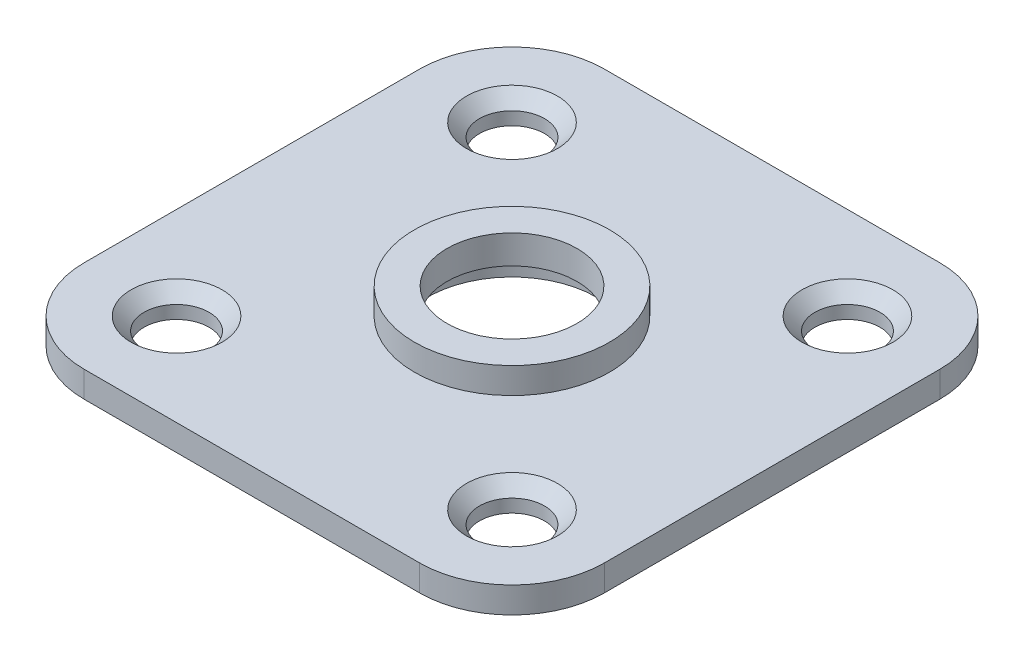
ISO-10303-21;
HEADER;
FILE_DESCRIPTION(('STEP AP214'),'2;1');
FILE_NAME('part.step','',(''),(''),'','','');
FILE_SCHEMA(('AUTOMOTIVE_DESIGN { 1 0 10303 214 1 1 1 1 }'));
ENDSEC;
DATA;
#1=APPLICATION_CONTEXT('core data for automotive mechanical design processes');
#2=APPLICATION_PROTOCOL_DEFINITION('international standard','automotive_design',2000,#1);
#3=PRODUCT_CONTEXT('',#1,'mechanical');
#4=PRODUCT('Part','Part','',(#3));
#5=PRODUCT_RELATED_PRODUCT_CATEGORY('part','',(#4));
#6=PRODUCT_DEFINITION_FORMATION('','',#4);
#7=PRODUCT_DEFINITION_CONTEXT('part definition',#1,'design');
#8=PRODUCT_DEFINITION('design','',#6,#7);
#9=PRODUCT_DEFINITION_SHAPE('','',#8);
#10=(LENGTH_UNIT() NAMED_UNIT(*) SI_UNIT(.MILLI.,.METRE.));
#11=(NAMED_UNIT(*) PLANE_ANGLE_UNIT() SI_UNIT($,.RADIAN.));
#12=(NAMED_UNIT(*) SI_UNIT($,.STERADIAN.) SOLID_ANGLE_UNIT());
#13=UNCERTAINTY_MEASURE_WITH_UNIT(LENGTH_MEASURE(1.E-05),#10,'distance_accuracy_value','');
#14=(GEOMETRIC_REPRESENTATION_CONTEXT(3) GLOBAL_UNCERTAINTY_ASSIGNED_CONTEXT((#13)) GLOBAL_UNIT_ASSIGNED_CONTEXT((#10,
#11,#12)) REPRESENTATION_CONTEXT('',''));
#15=CARTESIAN_POINT('',(0.,0.,0.));
#16=DIRECTION('',(0.,0.,1.));
#17=DIRECTION('',(1.,0.,0.));
#18=AXIS2_PLACEMENT_3D('',#15,#16,#17);
#19=CARTESIAN_POINT('',(25.4,-2.54,-25.4));
#20=DIRECTION('',(1.,0.,0.));
#21=DIRECTION('',(0.,0.,-1.));
#22=AXIS2_PLACEMENT_3D('',#19,#20,#21);
#23=PLANE('',#22);
#24=DIRECTION('',(0.,0.,-1.));
#25=VECTOR('',#24,1.);
#26=CARTESIAN_POINT('',(25.4,0.,-25.4));
#27=LINE('',#26,#25);
#28=CARTESIAN_POINT('',(25.4,0.,16.383));
#29=VERTEX_POINT('',#28);
#30=CARTESIAN_POINT('',(25.4,0.,-16.383));
#31=VERTEX_POINT('',#30);
#32=EDGE_CURVE('E122',#29,#31,#27,.T.);
#33=ORIENTED_EDGE('',*,*,#32,.F.);
#34=DIRECTION('',(0.,1.,0.));
#35=VECTOR('',#34,1.);
#36=CARTESIAN_POINT('',(25.4,-2.54,16.383));
#37=LINE('',#36,#35);
#38=CARTESIAN_POINT('',(25.4,-2.54,16.383));
#39=VERTEX_POINT('',#38);
#40=EDGE_CURVE('E173',#29,#39,#37,.F.);
#41=ORIENTED_EDGE('',*,*,#40,.T.);
#42=DIRECTION('',(0.,0.,-1.));
#43=VECTOR('',#42,1.);
#44=CARTESIAN_POINT('',(25.4,-2.54,-25.4));
#45=LINE('',#44,#43);
#46=CARTESIAN_POINT('',(25.4,-2.54,-16.383));
#47=VERTEX_POINT('',#46);
#48=EDGE_CURVE('E221',#39,#47,#45,.T.);
#49=ORIENTED_EDGE('',*,*,#48,.T.);
#50=DIRECTION('',(0.,1.,0.));
#51=VECTOR('',#50,1.);
#52=CARTESIAN_POINT('',(25.4,-2.54,-16.383));
#53=LINE('',#52,#51);
#54=EDGE_CURVE('E171',#47,#31,#53,.T.);
#55=ORIENTED_EDGE('',*,*,#54,.T.);
#56=EDGE_LOOP('',(#33,#41,#49,#55));
#57=FACE_BOUND('',#56,.T.);
#58=ADVANCED_FACE('F49',(#57),#23,.T.);
#59=CARTESIAN_POINT('',(-25.4,-2.54,25.4));
#60=DIRECTION('',(0.,0.,1.));
#61=DIRECTION('',(1.,0.,0.));
#62=AXIS2_PLACEMENT_3D('',#59,#60,#61);
#63=PLANE('',#62);
#64=DIRECTION('',(1.,0.,0.));
#65=VECTOR('',#64,1.);
#66=CARTESIAN_POINT('',(-25.4,0.,25.4));
#67=LINE('',#66,#65);
#68=CARTESIAN_POINT('',(-16.383,0.,25.4));
#69=VERTEX_POINT('',#68);
#70=CARTESIAN_POINT('',(16.383,0.,25.4));
#71=VERTEX_POINT('',#70);
#72=EDGE_CURVE('E148',#69,#71,#67,.T.);
#73=ORIENTED_EDGE('',*,*,#72,.F.);
#74=DIRECTION('',(0.,1.,0.));
#75=VECTOR('',#74,1.);
#76=CARTESIAN_POINT('',(-16.383,-2.54,25.4));
#77=LINE('',#76,#75);
#78=CARTESIAN_POINT('',(-16.383,-2.54,25.4));
#79=VERTEX_POINT('',#78);
#80=EDGE_CURVE('E72',#69,#79,#77,.F.);
#81=ORIENTED_EDGE('',*,*,#80,.T.);
#82=DIRECTION('',(1.,0.,0.));
#83=VECTOR('',#82,1.);
#84=CARTESIAN_POINT('',(-25.4,-2.54,25.4));
#85=LINE('',#84,#83);
#86=CARTESIAN_POINT('',(16.383,-2.54,25.4));
#87=VERTEX_POINT('',#86);
#88=EDGE_CURVE('E142',#79,#87,#85,.T.);
#89=ORIENTED_EDGE('',*,*,#88,.T.);
#90=DIRECTION('',(0.,1.,0.));
#91=VECTOR('',#90,1.);
#92=CARTESIAN_POINT('',(16.383,-2.54,25.4));
#93=LINE('',#92,#91);
#94=EDGE_CURVE('E167',#87,#71,#93,.T.);
#95=ORIENTED_EDGE('',*,*,#94,.T.);
#96=EDGE_LOOP('',(#73,#81,#89,#95));
#97=FACE_BOUND('',#96,.T.);
#98=ADVANCED_FACE('F231',(#97),#63,.T.);
#99=CARTESIAN_POINT('',(-25.4,-2.54,-25.4));
#100=DIRECTION('',(-1.,0.,0.));
#101=DIRECTION('',(0.,0.,1.));
#102=AXIS2_PLACEMENT_3D('',#99,#100,#101);
#103=PLANE('',#102);
#104=DIRECTION('',(0.,0.,1.));
#105=VECTOR('',#104,1.);
#106=CARTESIAN_POINT('',(-25.4,0.,-25.4));
#107=LINE('',#106,#105);
#108=CARTESIAN_POINT('',(-25.4,0.,-16.383));
#109=VERTEX_POINT('',#108);
#110=CARTESIAN_POINT('',(-25.4,0.,16.383));
#111=VERTEX_POINT('',#110);
#112=EDGE_CURVE('E137',#109,#111,#107,.T.);
#113=ORIENTED_EDGE('',*,*,#112,.F.);
#114=DIRECTION('',(0.,1.,0.));
#115=VECTOR('',#114,1.);
#116=CARTESIAN_POINT('',(-25.4,-2.54,-16.383));
#117=LINE('',#116,#115);
#118=CARTESIAN_POINT('',(-25.4,-2.54,-16.383));
#119=VERTEX_POINT('',#118);
#120=EDGE_CURVE('E159',#109,#119,#117,.F.);
#121=ORIENTED_EDGE('',*,*,#120,.T.);
#122=DIRECTION('',(0.,0.,1.));
#123=VECTOR('',#122,1.);
#124=CARTESIAN_POINT('',(-25.4,-2.54,-25.4));
#125=LINE('',#124,#123);
#126=CARTESIAN_POINT('',(-25.4,-2.54,16.383));
#127=VERTEX_POINT('',#126);
#128=EDGE_CURVE('E145',#119,#127,#125,.T.);
#129=ORIENTED_EDGE('',*,*,#128,.T.);
#130=DIRECTION('',(0.,1.,0.));
#131=VECTOR('',#130,1.);
#132=CARTESIAN_POINT('',(-25.4,-2.54,16.383));
#133=LINE('',#132,#131);
#134=EDGE_CURVE('E156',#127,#111,#133,.T.);
#135=ORIENTED_EDGE('',*,*,#134,.T.);
#136=EDGE_LOOP('',(#113,#121,#129,#135));
#137=FACE_BOUND('',#136,.T.);
#138=ADVANCED_FACE('F240',(#137),#103,.T.);
#139=CARTESIAN_POINT('',(-25.4,-2.54,-25.4));
#140=DIRECTION('',(0.,0.,-1.));
#141=DIRECTION('',(-1.,0.,0.));
#142=AXIS2_PLACEMENT_3D('',#139,#140,#141);
#143=PLANE('',#142);
#144=DIRECTION('',(-1.,0.,0.));
#145=VECTOR('',#144,1.);
#146=CARTESIAN_POINT('',(-25.4,-2.54,-25.4));
#147=LINE('',#146,#145);
#148=CARTESIAN_POINT('',(16.383,-2.54,-25.4));
#149=VERTEX_POINT('',#148);
#150=CARTESIAN_POINT('',(-16.383,-2.54,-25.4));
#151=VERTEX_POINT('',#150);
#152=EDGE_CURVE('E224',#149,#151,#147,.T.);
#153=ORIENTED_EDGE('',*,*,#152,.T.);
#154=DIRECTION('',(0.,1.,0.));
#155=VECTOR('',#154,1.);
#156=CARTESIAN_POINT('',(-16.383,-2.54,-25.4));
#157=LINE('',#156,#155);
#158=CARTESIAN_POINT('',(-16.383,0.,-25.4));
#159=VERTEX_POINT('',#158);
#160=EDGE_CURVE('E128',#151,#159,#157,.T.);
#161=ORIENTED_EDGE('',*,*,#160,.T.);
#162=DIRECTION('',(-1.,0.,0.));
#163=VECTOR('',#162,1.);
#164=CARTESIAN_POINT('',(-25.4,0.,-25.4));
#165=LINE('',#164,#163);
#166=CARTESIAN_POINT('',(16.383,0.,-25.4));
#167=VERTEX_POINT('',#166);
#168=EDGE_CURVE('E120',#167,#159,#165,.T.);
#169=ORIENTED_EDGE('',*,*,#168,.F.);
#170=DIRECTION('',(0.,1.,0.));
#171=VECTOR('',#170,1.);
#172=CARTESIAN_POINT('',(16.383,-2.54,-25.4));
#173=LINE('',#172,#171);
#174=EDGE_CURVE('E134',#167,#149,#173,.F.);
#175=ORIENTED_EDGE('',*,*,#174,.T.);
#176=EDGE_LOOP('',(#153,#161,#169,#175));
#177=FACE_BOUND('',#176,.T.);
#178=ADVANCED_FACE('F133',(#177),#143,.T.);
#179=CARTESIAN_POINT('',(0.,-2.54,0.));
#180=DIRECTION('',(0.,1.,0.));
#181=DIRECTION('',(0.,0.,1.));
#182=AXIS2_PLACEMENT_3D('',#179,#180,#181);
#183=PLANE('',#182);
#184=CARTESIAN_POINT('',(-16.383,-2.54,16.383));
#185=DIRECTION('',(0.,1.,0.));
#186=DIRECTION('',(0.,0.,1.));
#187=AXIS2_PLACEMENT_3D('',#184,#185,#186);
#188=CIRCLE('',#187,3.175);
#189=CARTESIAN_POINT('',(-16.383,-2.54,19.558));
#190=VERTEX_POINT('',#189);
#191=EDGE_CURVE('E469',#190,#190,#188,.T.);
#192=ORIENTED_EDGE('',*,*,#191,.T.);
#193=EDGE_LOOP('',(#192));
#194=FACE_BOUND('',#193,.T.);
#195=CARTESIAN_POINT('',(16.383,-2.54,16.383));
#196=DIRECTION('',(0.,-1.,0.));
#197=DIRECTION('',(0.,0.,1.));
#198=AXIS2_PLACEMENT_3D('',#195,#196,#197);
#199=CIRCLE('',#198,3.175);
#200=CARTESIAN_POINT('',(16.383,-2.54,19.558));
#201=VERTEX_POINT('',#200);
#202=EDGE_CURVE('E409',#201,#201,#199,.T.);
#203=ORIENTED_EDGE('',*,*,#202,.F.);
#204=EDGE_LOOP('',(#203));
#205=FACE_BOUND('',#204,.T.);
#206=CARTESIAN_POINT('',(16.383,-2.54,-16.383));
#207=DIRECTION('',(0.,1.,0.));
#208=DIRECTION('',(0.,0.,-1.));
#209=AXIS2_PLACEMENT_3D('',#206,#207,#208);
#210=CIRCLE('',#209,3.175);
#211=CARTESIAN_POINT('',(16.383,-2.54,-19.558));
#212=VERTEX_POINT('',#211);
#213=EDGE_CURVE('E403',#212,#212,#210,.T.);
#214=ORIENTED_EDGE('',*,*,#213,.T.);
#215=EDGE_LOOP('',(#214));
#216=FACE_BOUND('',#215,.T.);
#217=CARTESIAN_POINT('',(-16.383,-2.54,-16.383));
#218=DIRECTION('',(0.,-1.,0.));
#219=DIRECTION('',(0.,0.,-1.));
#220=AXIS2_PLACEMENT_3D('',#217,#218,#219);
#221=CIRCLE('',#220,3.175);
#222=CARTESIAN_POINT('',(-16.383,-2.54,-19.558));
#223=VERTEX_POINT('',#222);
#224=EDGE_CURVE('E400',#223,#223,#221,.T.);
#225=ORIENTED_EDGE('',*,*,#224,.F.);
#226=EDGE_LOOP('',(#225));
#227=FACE_BOUND('',#226,.T.);
#228=CARTESIAN_POINT('',(0.,-2.54,0.));
#229=DIRECTION('',(0.,-1.,0.));
#230=DIRECTION('',(0.,0.,-1.));
#231=AXIS2_PLACEMENT_3D('',#228,#229,#230);
#232=CIRCLE('',#231,8.255);
#233=CARTESIAN_POINT('',(0.,-2.54,-8.255));
#234=VERTEX_POINT('',#233);
#235=EDGE_CURVE('E414',#234,#234,#232,.T.);
#236=ORIENTED_EDGE('',*,*,#235,.F.);
#237=EDGE_LOOP('',(#236));
#238=FACE_BOUND('',#237,.T.);
#239=ORIENTED_EDGE('',*,*,#128,.F.);
#240=CARTESIAN_POINT('',(-16.383,-2.54,-16.383));
#241=DIRECTION('',(0.,1.,0.));
#242=DIRECTION('',(0.,0.,1.));
#243=AXIS2_PLACEMENT_3D('',#240,#241,#242);
#244=CIRCLE('',#243,9.017);
#245=EDGE_CURVE('E165',#119,#151,#244,.F.);
#246=ORIENTED_EDGE('',*,*,#245,.T.);
#247=ORIENTED_EDGE('',*,*,#152,.F.);
#248=CARTESIAN_POINT('',(16.383,-2.54,-16.383));
#249=DIRECTION('',(0.,1.,0.));
#250=DIRECTION('',(0.,0.,1.));
#251=AXIS2_PLACEMENT_3D('',#248,#249,#250);
#252=CIRCLE('',#251,9.017);
#253=EDGE_CURVE('E141',#149,#47,#252,.F.);
#254=ORIENTED_EDGE('',*,*,#253,.T.);
#255=ORIENTED_EDGE('',*,*,#48,.F.);
#256=CARTESIAN_POINT('',(16.383,-2.54,16.383));
#257=DIRECTION('',(0.,1.,0.));
#258=DIRECTION('',(0.,0.,1.));
#259=AXIS2_PLACEMENT_3D('',#256,#257,#258);
#260=CIRCLE('',#259,9.017);
#261=EDGE_CURVE('E65',#39,#87,#260,.F.);
#262=ORIENTED_EDGE('',*,*,#261,.T.);
#263=ORIENTED_EDGE('',*,*,#88,.F.);
#264=CARTESIAN_POINT('',(-16.383,-2.54,16.383));
#265=DIRECTION('',(0.,1.,0.));
#266=DIRECTION('',(0.,0.,1.));
#267=AXIS2_PLACEMENT_3D('',#264,#265,#266);
#268=CIRCLE('',#267,9.017);
#269=EDGE_CURVE('E163',#79,#127,#268,.F.);
#270=ORIENTED_EDGE('',*,*,#269,.T.);
#271=EDGE_LOOP('',(#239,#246,#247,#254,#255,#262,#263,#270));
#272=FACE_BOUND('',#271,.T.);
#273=ADVANCED_FACE('F208',(#194,#205,#216,#227,#238,#272),#183,.F.);
#274=CARTESIAN_POINT('',(0.,0.,0.));
#275=DIRECTION('',(0.,1.,0.));
#276=DIRECTION('',(0.,0.,1.));
#277=AXIS2_PLACEMENT_3D('',#274,#275,#276);
#278=PLANE('',#277);
#279=CARTESIAN_POINT('',(-16.383,0.,16.383));
#280=DIRECTION('',(0.,1.,0.));
#281=DIRECTION('',(0.,0.,1.));
#282=AXIS2_PLACEMENT_3D('',#279,#280,#281);
#283=CIRCLE('',#282,4.445);
#284=CARTESIAN_POINT('',(-16.383,0.,20.828));
#285=VERTEX_POINT('',#284);
#286=EDGE_CURVE('E185',#285,#285,#283,.F.);
#287=ORIENTED_EDGE('',*,*,#286,.T.);
#288=EDGE_LOOP('',(#287));
#289=FACE_BOUND('',#288,.T.);
#290=CARTESIAN_POINT('',(16.383,0.,16.383));
#291=DIRECTION('',(0.,1.,0.));
#292=DIRECTION('',(0.,0.,1.));
#293=AXIS2_PLACEMENT_3D('',#290,#291,#292);
#294=CIRCLE('',#293,4.44499999999999);
#295=CARTESIAN_POINT('',(16.383,0.,20.828));
#296=VERTEX_POINT('',#295);
#297=EDGE_CURVE('E182',#296,#296,#294,.F.);
#298=ORIENTED_EDGE('',*,*,#297,.T.);
#299=EDGE_LOOP('',(#298));
#300=FACE_BOUND('',#299,.T.);
#301=CARTESIAN_POINT('',(16.383,0.,-16.383));
#302=DIRECTION('',(0.,1.,0.));
#303=DIRECTION('',(0.,0.,1.));
#304=AXIS2_PLACEMENT_3D('',#301,#302,#303);
#305=CIRCLE('',#304,4.445);
#306=CARTESIAN_POINT('',(16.383,0.,-11.938));
#307=VERTEX_POINT('',#306);
#308=EDGE_CURVE('E179',#307,#307,#305,.F.);
#309=ORIENTED_EDGE('',*,*,#308,.T.);
#310=EDGE_LOOP('',(#309));
#311=FACE_BOUND('',#310,.T.);
#312=CARTESIAN_POINT('',(-16.383,0.,-16.383));
#313=DIRECTION('',(0.,1.,0.));
#314=DIRECTION('',(0.,0.,1.));
#315=AXIS2_PLACEMENT_3D('',#312,#313,#314);
#316=CIRCLE('',#315,4.44499999999999);
#317=CARTESIAN_POINT('',(-16.383,0.,-11.938));
#318=VERTEX_POINT('',#317);
#319=EDGE_CURVE('E176',#318,#318,#316,.F.);
#320=ORIENTED_EDGE('',*,*,#319,.T.);
#321=EDGE_LOOP('',(#320));
#322=FACE_BOUND('',#321,.T.);
#323=CARTESIAN_POINT('',(0.,0.,0.));
#324=DIRECTION('',(0.,1.,0.));
#325=DIRECTION('',(0.,0.,1.));
#326=AXIS2_PLACEMENT_3D('',#323,#324,#325);
#327=CIRCLE('',#326,9.525);
#328=CARTESIAN_POINT('',(0.,0.,9.525));
#329=VERTEX_POINT('',#328);
#330=EDGE_CURVE('E175',#329,#329,#327,.T.);
#331=ORIENTED_EDGE('',*,*,#330,.F.);
#332=EDGE_LOOP('',(#331));
#333=FACE_BOUND('',#332,.T.);
#334=ORIENTED_EDGE('',*,*,#168,.T.);
#335=CARTESIAN_POINT('',(-16.383,0.,-16.383));
#336=DIRECTION('',(0.,1.,0.));
#337=DIRECTION('',(0.,0.,1.));
#338=AXIS2_PLACEMENT_3D('',#335,#336,#337);
#339=CIRCLE('',#338,9.017);
#340=EDGE_CURVE('E154',#159,#109,#339,.T.);
#341=ORIENTED_EDGE('',*,*,#340,.T.);
#342=ORIENTED_EDGE('',*,*,#112,.T.);
#343=CARTESIAN_POINT('',(-16.383,0.,16.383));
#344=DIRECTION('',(0.,1.,0.));
#345=DIRECTION('',(0.,0.,1.));
#346=AXIS2_PLACEMENT_3D('',#343,#344,#345);
#347=CIRCLE('',#346,9.017);
#348=EDGE_CURVE('E152',#111,#69,#347,.T.);
#349=ORIENTED_EDGE('',*,*,#348,.T.);
#350=ORIENTED_EDGE('',*,*,#72,.T.);
#351=CARTESIAN_POINT('',(16.383,0.,16.383));
#352=DIRECTION('',(0.,1.,0.));
#353=DIRECTION('',(0.,0.,1.));
#354=AXIS2_PLACEMENT_3D('',#351,#352,#353);
#355=CIRCLE('',#354,9.017);
#356=EDGE_CURVE('E127',#71,#29,#355,.T.);
#357=ORIENTED_EDGE('',*,*,#356,.T.);
#358=ORIENTED_EDGE('',*,*,#32,.T.);
#359=CARTESIAN_POINT('',(16.383,0.,-16.383));
#360=DIRECTION('',(0.,1.,0.));
#361=DIRECTION('',(0.,0.,1.));
#362=AXIS2_PLACEMENT_3D('',#359,#360,#361);
#363=CIRCLE('',#362,9.017);
#364=EDGE_CURVE('E117',#31,#167,#363,.T.);
#365=ORIENTED_EDGE('',*,*,#364,.T.);
#366=EDGE_LOOP('',(#334,#341,#342,#349,#350,#357,#358,#365));
#367=FACE_BOUND('',#366,.T.);
#368=ADVANCED_FACE('F119',(#289,#300,#311,#322,#333,#367),#278,.T.);
#369=CARTESIAN_POINT('',(-16.383,-2.54,-16.383));
#370=DIRECTION('',(0.,1.,0.));
#371=DIRECTION('',(0.,0.,1.));
#372=AXIS2_PLACEMENT_3D('',#369,#370,#371);
#373=CYLINDRICAL_SURFACE('',#372,9.017);
#374=ORIENTED_EDGE('',*,*,#245,.F.);
#375=ORIENTED_EDGE('',*,*,#120,.F.);
#376=ORIENTED_EDGE('',*,*,#340,.F.);
#377=ORIENTED_EDGE('',*,*,#160,.F.);
#378=EDGE_LOOP('',(#374,#375,#376,#377));
#379=FACE_BOUND('',#378,.T.);
#380=ADVANCED_FACE('F207',(#379),#373,.T.);
#381=CARTESIAN_POINT('',(-16.383,-2.54,16.383));
#382=DIRECTION('',(0.,1.,0.));
#383=DIRECTION('',(0.,0.,1.));
#384=AXIS2_PLACEMENT_3D('',#381,#382,#383);
#385=CYLINDRICAL_SURFACE('',#384,9.017);
#386=ORIENTED_EDGE('',*,*,#269,.F.);
#387=ORIENTED_EDGE('',*,*,#80,.F.);
#388=ORIENTED_EDGE('',*,*,#348,.F.);
#389=ORIENTED_EDGE('',*,*,#134,.F.);
#390=EDGE_LOOP('',(#386,#387,#388,#389));
#391=FACE_BOUND('',#390,.T.);
#392=ADVANCED_FACE('F235',(#391),#385,.T.);
#393=CARTESIAN_POINT('',(16.383,-2.54,16.383));
#394=DIRECTION('',(0.,1.,0.));
#395=DIRECTION('',(0.,0.,1.));
#396=AXIS2_PLACEMENT_3D('',#393,#394,#395);
#397=CYLINDRICAL_SURFACE('',#396,9.017);
#398=ORIENTED_EDGE('',*,*,#261,.F.);
#399=ORIENTED_EDGE('',*,*,#40,.F.);
#400=ORIENTED_EDGE('',*,*,#356,.F.);
#401=ORIENTED_EDGE('',*,*,#94,.F.);
#402=EDGE_LOOP('',(#398,#399,#400,#401));
#403=FACE_BOUND('',#402,.T.);
#404=ADVANCED_FACE('F246',(#403),#397,.T.);
#405=CARTESIAN_POINT('',(16.383,-2.54,-16.383));
#406=DIRECTION('',(0.,1.,0.));
#407=DIRECTION('',(0.,0.,1.));
#408=AXIS2_PLACEMENT_3D('',#405,#406,#407);
#409=CYLINDRICAL_SURFACE('',#408,9.017);
#410=ORIENTED_EDGE('',*,*,#253,.F.);
#411=ORIENTED_EDGE('',*,*,#174,.F.);
#412=ORIENTED_EDGE('',*,*,#364,.F.);
#413=ORIENTED_EDGE('',*,*,#54,.F.);
#414=EDGE_LOOP('',(#410,#411,#412,#413));
#415=FACE_BOUND('',#414,.T.);
#416=ADVANCED_FACE('F140',(#415),#409,.T.);
#417=CARTESIAN_POINT('',(0.,2.54,0.));
#418=DIRECTION('',(0.,-1.,0.));
#419=DIRECTION('',(0.,0.,-1.));
#420=AXIS2_PLACEMENT_3D('',#417,#418,#419);
#421=CYLINDRICAL_SURFACE('',#420,9.525);
#422=CARTESIAN_POINT('',(0.,2.54,0.));
#423=DIRECTION('',(0.,1.,0.));
#424=DIRECTION('',(0.,0.,1.));
#425=AXIS2_PLACEMENT_3D('',#422,#423,#424);
#426=CIRCLE('',#425,9.525);
#427=CARTESIAN_POINT('',(0.,2.54,9.525));
#428=VERTEX_POINT('',#427);
#429=EDGE_CURVE('E219',#428,#428,#426,.T.);
#430=ORIENTED_EDGE('',*,*,#429,.F.);
#431=EDGE_LOOP('',(#430));
#432=FACE_BOUND('',#431,.T.);
#433=ORIENTED_EDGE('',*,*,#330,.T.);
#434=EDGE_LOOP('',(#433));
#435=FACE_BOUND('',#434,.T.);
#436=ADVANCED_FACE('F253',(#432,#435),#421,.T.);
#437=CARTESIAN_POINT('',(0.,2.54,0.));
#438=DIRECTION('',(0.,1.,0.));
#439=DIRECTION('',(0.,0.,1.));
#440=AXIS2_PLACEMENT_3D('',#437,#438,#439);
#441=PLANE('',#440);
#442=CARTESIAN_POINT('',(0.,2.54,0.));
#443=DIRECTION('',(0.,-1.,0.));
#444=DIRECTION('',(0.,0.,-1.));
#445=AXIS2_PLACEMENT_3D('',#442,#443,#444);
#446=CIRCLE('',#445,6.35);
#447=CARTESIAN_POINT('',(0.,2.54,-6.35));
#448=VERTEX_POINT('',#447);
#449=EDGE_CURVE('E406',#448,#448,#446,.T.);
#450=ORIENTED_EDGE('',*,*,#449,.T.);
#451=EDGE_LOOP('',(#450));
#452=FACE_BOUND('',#451,.T.);
#453=ORIENTED_EDGE('',*,*,#429,.T.);
#454=EDGE_LOOP('',(#453));
#455=FACE_BOUND('',#454,.T.);
#456=ADVANCED_FACE('F290',(#452,#455),#441,.T.);
#457=CARTESIAN_POINT('',(0.,-0.254,0.));
#458=DIRECTION('',(0.,-1.,0.));
#459=DIRECTION('',(0.,0.,-1.));
#460=AXIS2_PLACEMENT_3D('',#457,#458,#459);
#461=CYLINDRICAL_SURFACE('',#460,8.255);
#462=CARTESIAN_POINT('',(0.,-0.254,0.));
#463=DIRECTION('',(0.,-1.,0.));
#464=DIRECTION('',(0.,0.,-1.));
#465=AXIS2_PLACEMENT_3D('',#462,#463,#464);
#466=CIRCLE('',#465,8.255);
#467=CARTESIAN_POINT('',(0.,-0.254,-8.255));
#468=VERTEX_POINT('',#467);
#469=EDGE_CURVE('E416',#468,#468,#466,.T.);
#470=ORIENTED_EDGE('',*,*,#469,.F.);
#471=EDGE_LOOP('',(#470));
#472=FACE_BOUND('',#471,.T.);
#473=ORIENTED_EDGE('',*,*,#235,.T.);
#474=EDGE_LOOP('',(#473));
#475=FACE_BOUND('',#474,.T.);
#476=ADVANCED_FACE('F299',(#472,#475),#461,.F.);
#477=CARTESIAN_POINT('',(0.,-0.254,0.));
#478=DIRECTION('',(0.,-1.,0.));
#479=DIRECTION('',(0.,0.,-1.));
#480=AXIS2_PLACEMENT_3D('',#477,#478,#479);
#481=PLANE('',#480);
#482=CARTESIAN_POINT('',(0.,-0.254,0.));
#483=DIRECTION('',(0.,-1.,0.));
#484=DIRECTION('',(0.,0.,-1.));
#485=AXIS2_PLACEMENT_3D('',#482,#483,#484);
#486=CIRCLE('',#485,6.35);
#487=CARTESIAN_POINT('',(0.,-0.254,-6.35));
#488=VERTEX_POINT('',#487);
#489=EDGE_CURVE('E402',#488,#488,#486,.T.);
#490=ORIENTED_EDGE('',*,*,#489,.F.);
#491=EDGE_LOOP('',(#490));
#492=FACE_BOUND('',#491,.T.);
#493=ORIENTED_EDGE('',*,*,#469,.T.);
#494=EDGE_LOOP('',(#493));
#495=FACE_BOUND('',#494,.T.);
#496=ADVANCED_FACE('F309',(#492,#495),#481,.T.);
#497=CARTESIAN_POINT('',(0.,2.54,0.));
#498=DIRECTION('',(0.,-1.,0.));
#499=DIRECTION('',(0.,0.,-1.));
#500=AXIS2_PLACEMENT_3D('',#497,#498,#499);
#501=CYLINDRICAL_SURFACE('',#500,6.35);
#502=ORIENTED_EDGE('',*,*,#449,.F.);
#503=EDGE_LOOP('',(#502));
#504=FACE_BOUND('',#503,.T.);
#505=ORIENTED_EDGE('',*,*,#489,.T.);
#506=EDGE_LOOP('',(#505));
#507=FACE_BOUND('',#506,.T.);
#508=ADVANCED_FACE('F321',(#504,#507),#501,.F.);
#509=CARTESIAN_POINT('',(-16.383,2.54,-16.383));
#510=DIRECTION('',(0.,-1.,0.));
#511=DIRECTION('',(0.,0.,-1.));
#512=AXIS2_PLACEMENT_3D('',#509,#510,#511);
#513=CYLINDRICAL_SURFACE('',#512,3.175);
#514=CARTESIAN_POINT('',(-16.383,-1.26999999999998,-16.383));
#515=DIRECTION('',(0.,1.,0.));
#516=DIRECTION('',(0.,0.,1.));
#517=AXIS2_PLACEMENT_3D('',#514,#515,#516);
#518=CIRCLE('',#517,3.175);
#519=CARTESIAN_POINT('',(-16.383,-1.26999999999998,-13.208));
#520=VERTEX_POINT('',#519);
#521=EDGE_CURVE('E11',#520,#520,#518,.T.);
#522=ORIENTED_EDGE('',*,*,#521,.T.);
#523=EDGE_LOOP('',(#522));
#524=FACE_BOUND('',#523,.T.);
#525=ORIENTED_EDGE('',*,*,#224,.T.);
#526=EDGE_LOOP('',(#525));
#527=FACE_BOUND('',#526,.T.);
#528=ADVANCED_FACE('F330',(#524,#527),#513,.F.);
#529=CARTESIAN_POINT('',(16.383,2.54,-16.383));
#530=DIRECTION('',(0.,-1.,0.));
#531=DIRECTION('',(0.,0.,-1.));
#532=AXIS2_PLACEMENT_3D('',#529,#530,#531);
#533=CYLINDRICAL_SURFACE('',#532,3.175);
#534=CARTESIAN_POINT('',(16.383,-1.27,-16.383));
#535=DIRECTION('',(0.,1.,0.));
#536=DIRECTION('',(0.,0.,1.));
#537=AXIS2_PLACEMENT_3D('',#534,#535,#536);
#538=CIRCLE('',#537,3.175);
#539=CARTESIAN_POINT('',(16.383,-1.27,-13.208));
#540=VERTEX_POINT('',#539);
#541=EDGE_CURVE('E58',#540,#540,#538,.T.);
#542=ORIENTED_EDGE('',*,*,#541,.T.);
#543=EDGE_LOOP('',(#542));
#544=FACE_BOUND('',#543,.T.);
#545=ORIENTED_EDGE('',*,*,#213,.F.);
#546=EDGE_LOOP('',(#545));
#547=FACE_BOUND('',#546,.T.);
#548=ADVANCED_FACE('F196',(#544,#547),#533,.F.);
#549=CARTESIAN_POINT('',(16.383,2.54,16.383));
#550=DIRECTION('',(0.,-1.,0.));
#551=DIRECTION('',(0.,0.,-1.));
#552=AXIS2_PLACEMENT_3D('',#549,#550,#551);
#553=CYLINDRICAL_SURFACE('',#552,3.175);
#554=CARTESIAN_POINT('',(16.383,-1.26999999999998,16.383));
#555=DIRECTION('',(0.,1.,0.));
#556=DIRECTION('',(0.,0.,1.));
#557=AXIS2_PLACEMENT_3D('',#554,#555,#556);
#558=CIRCLE('',#557,3.175);
#559=CARTESIAN_POINT('',(16.383,-1.26999999999998,19.558));
#560=VERTEX_POINT('',#559);
#561=EDGE_CURVE('E191',#560,#560,#558,.T.);
#562=ORIENTED_EDGE('',*,*,#561,.T.);
#563=EDGE_LOOP('',(#562));
#564=FACE_BOUND('',#563,.T.);
#565=ORIENTED_EDGE('',*,*,#202,.T.);
#566=EDGE_LOOP('',(#565));
#567=FACE_BOUND('',#566,.T.);
#568=ADVANCED_FACE('F348',(#564,#567),#553,.F.);
#569=CARTESIAN_POINT('',(-16.383,2.54,16.383));
#570=DIRECTION('',(0.,-1.,0.));
#571=DIRECTION('',(0.,0.,-1.));
#572=AXIS2_PLACEMENT_3D('',#569,#570,#571);
#573=CYLINDRICAL_SURFACE('',#572,3.175);
#574=CARTESIAN_POINT('',(-16.383,-1.27,16.383));
#575=DIRECTION('',(0.,1.,0.));
#576=DIRECTION('',(0.,0.,1.));
#577=AXIS2_PLACEMENT_3D('',#574,#575,#576);
#578=CIRCLE('',#577,3.175);
#579=CARTESIAN_POINT('',(-16.383,-1.27,19.558));
#580=VERTEX_POINT('',#579);
#581=EDGE_CURVE('E188',#580,#580,#578,.T.);
#582=ORIENTED_EDGE('',*,*,#581,.T.);
#583=EDGE_LOOP('',(#582));
#584=FACE_BOUND('',#583,.T.);
#585=ORIENTED_EDGE('',*,*,#191,.F.);
#586=EDGE_LOOP('',(#585));
#587=FACE_BOUND('',#586,.T.);
#588=ADVANCED_FACE('F357',(#584,#587),#573,.F.);
#589=CARTESIAN_POINT('',(-16.383,0.,16.383));
#590=DIRECTION('',(0.,1.,0.));
#591=DIRECTION('',(0.,0.,1.));
#592=AXIS2_PLACEMENT_3D('',#589,#590,#591);
#593=CONICAL_SURFACE('',#592,4.445,0.785398163397446);
#594=ORIENTED_EDGE('',*,*,#581,.F.);
#595=EDGE_LOOP('',(#594));
#596=FACE_BOUND('',#595,.T.);
#597=ORIENTED_EDGE('',*,*,#286,.F.);
#598=EDGE_LOOP('',(#597));
#599=FACE_BOUND('',#598,.T.);
#600=ADVANCED_FACE('F367',(#596,#599),#593,.F.);
#601=CARTESIAN_POINT('',(16.383,-1.26999999999998,16.383));
#602=DIRECTION('',(0.,1.,0.));
#603=DIRECTION('',(0.,0.,1.));
#604=AXIS2_PLACEMENT_3D('',#601,#602,#603);
#605=CONICAL_SURFACE('',#604,3.175,0.785398163397452);
#606=ORIENTED_EDGE('',*,*,#297,.F.);
#607=EDGE_LOOP('',(#606));
#608=FACE_BOUND('',#607,.T.);
#609=ORIENTED_EDGE('',*,*,#561,.F.);
#610=EDGE_LOOP('',(#609));
#611=FACE_BOUND('',#610,.T.);
#612=ADVANCED_FACE('F202',(#608,#611),#605,.F.);
#613=CARTESIAN_POINT('',(16.383,0.,-16.383));
#614=DIRECTION('',(0.,1.,0.));
#615=DIRECTION('',(0.,0.,1.));
#616=AXIS2_PLACEMENT_3D('',#613,#614,#615);
#617=CONICAL_SURFACE('',#616,4.445,0.785398163397448);
#618=ORIENTED_EDGE('',*,*,#541,.F.);
#619=EDGE_LOOP('',(#618));
#620=FACE_BOUND('',#619,.T.);
#621=ORIENTED_EDGE('',*,*,#308,.F.);
#622=EDGE_LOOP('',(#621));
#623=FACE_BOUND('',#622,.T.);
#624=ADVANCED_FACE('F199',(#620,#623),#617,.F.);
#625=CARTESIAN_POINT('',(-16.383,-1.26999999999998,-16.383));
#626=DIRECTION('',(0.,1.,0.));
#627=DIRECTION('',(0.,0.,1.));
#628=AXIS2_PLACEMENT_3D('',#625,#626,#627);
#629=CONICAL_SURFACE('',#628,3.175,0.785398163397452);
#630=ORIENTED_EDGE('',*,*,#319,.F.);
#631=EDGE_LOOP('',(#630));
#632=FACE_BOUND('',#631,.T.);
#633=ORIENTED_EDGE('',*,*,#521,.F.);
#634=EDGE_LOOP('',(#633));
#635=FACE_BOUND('',#634,.T.);
#636=ADVANCED_FACE('F52',(#632,#635),#629,.F.);
#637=CLOSED_SHELL('',(#58,#98,#138,#178,#273,#368,#380,#392,#404,#416,#436,#456,#476,#496,#508,
#528,#548,#568,#588,#600,#612,#624,#636));
#638=MANIFOLD_SOLID_BREP('B2',#637);
#639=ADVANCED_BREP_SHAPE_REPRESENTATION('',(#18,#638),#14);
#640=SHAPE_DEFINITION_REPRESENTATION(#9,#639);
ENDSEC;
END-ISO-10303-21;
